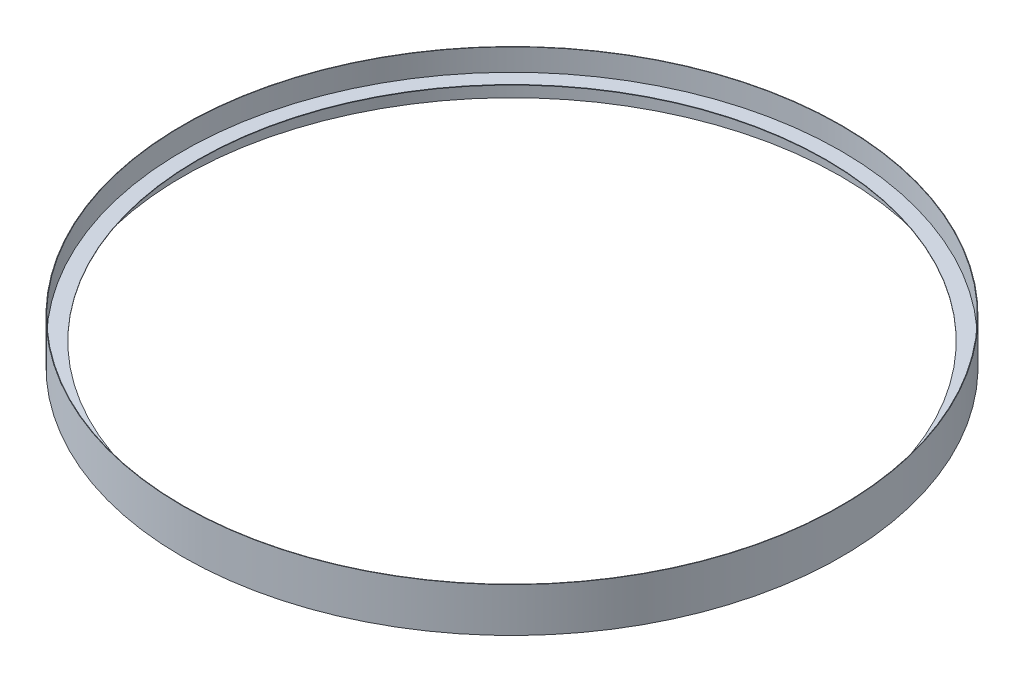
ISO-10303-21;
HEADER;
FILE_DESCRIPTION(('STEP AP214'),'2;1');
FILE_NAME('part.step','',(''),(''),'','','');
FILE_SCHEMA(('AUTOMOTIVE_DESIGN { 1 0 10303 214 1 1 1 1 }'));
ENDSEC;
DATA;
#1=APPLICATION_CONTEXT('core data for automotive mechanical design processes');
#2=APPLICATION_PROTOCOL_DEFINITION('international standard','automotive_design',2000,#1);
#3=PRODUCT_CONTEXT('',#1,'mechanical');
#4=PRODUCT('Part','Part','',(#3));
#5=PRODUCT_RELATED_PRODUCT_CATEGORY('part','',(#4));
#6=PRODUCT_DEFINITION_FORMATION('','',#4);
#7=PRODUCT_DEFINITION_CONTEXT('part definition',#1,'design');
#8=PRODUCT_DEFINITION('design','',#6,#7);
#9=PRODUCT_DEFINITION_SHAPE('','',#8);
#10=(LENGTH_UNIT() NAMED_UNIT(*) SI_UNIT(.MILLI.,.METRE.));
#11=(NAMED_UNIT(*) PLANE_ANGLE_UNIT() SI_UNIT($,.RADIAN.));
#12=(NAMED_UNIT(*) SI_UNIT($,.STERADIAN.) SOLID_ANGLE_UNIT());
#13=UNCERTAINTY_MEASURE_WITH_UNIT(LENGTH_MEASURE(1.E-05),#10,'distance_accuracy_value','');
#14=(GEOMETRIC_REPRESENTATION_CONTEXT(3) GLOBAL_UNCERTAINTY_ASSIGNED_CONTEXT((#13)) GLOBAL_UNIT_ASSIGNED_CONTEXT((#10,
#11,#12)) REPRESENTATION_CONTEXT('',''));
#15=CARTESIAN_POINT('',(0.,0.,0.));
#16=DIRECTION('',(0.,0.,1.));
#17=DIRECTION('',(1.,0.,0.));
#18=AXIS2_PLACEMENT_3D('',#15,#16,#17);
#19=CARTESIAN_POINT('',(0.,0.,0.));
#20=DIRECTION('',(0.,-1.,0.));
#21=DIRECTION('',(0.,0.,-1.));
#22=AXIS2_PLACEMENT_3D('',#19,#20,#21);
#23=CYLINDRICAL_SURFACE('',#22,1493.);
#24=CARTESIAN_POINT('',(0.,2.,0.));
#25=DIRECTION('',(0.,-1.,0.));
#26=DIRECTION('',(0.,0.,-1.));
#27=AXIS2_PLACEMENT_3D('',#24,#25,#26);
#28=CIRCLE('',#27,1493.);
#29=CARTESIAN_POINT('',(0.,2.,-1493.));
#30=VERTEX_POINT('',#29);
#31=EDGE_CURVE('E63',#30,#30,#28,.T.);
#32=ORIENTED_EDGE('',*,*,#31,.T.);
#33=EDGE_LOOP('',(#32));
#34=FACE_BOUND('',#33,.T.);
#35=CARTESIAN_POINT('',(0.,102.,0.));
#36=DIRECTION('',(0.,-1.,0.));
#37=DIRECTION('',(0.,0.,-1.));
#38=AXIS2_PLACEMENT_3D('',#35,#36,#37);
#39=CIRCLE('',#38,1493.);
#40=CARTESIAN_POINT('',(0.,102.,-1493.));
#41=VERTEX_POINT('',#40);
#42=EDGE_CURVE('E10',#41,#41,#39,.T.);
#43=ORIENTED_EDGE('',*,*,#42,.F.);
#44=EDGE_LOOP('',(#43));
#45=FACE_BOUND('',#44,.T.);
#46=ADVANCED_FACE('F35',(#34,#45),#23,.F.);
#47=CARTESIAN_POINT('',(1493.,102.,0.));
#48=DIRECTION('',(0.,1.,0.));
#49=DIRECTION('',(0.,0.,1.));
#50=AXIS2_PLACEMENT_3D('',#47,#48,#49);
#51=PLANE('',#50);
#52=ORIENTED_EDGE('',*,*,#42,.T.);
#53=EDGE_LOOP('',(#52));
#54=FACE_BOUND('',#53,.T.);
#55=CARTESIAN_POINT('',(0.,102.,0.));
#56=DIRECTION('',(0.,-1.,0.));
#57=DIRECTION('',(0.,0.,-1.));
#58=AXIS2_PLACEMENT_3D('',#55,#56,#57);
#59=CIRCLE('',#58,1495.);
#60=CARTESIAN_POINT('',(0.,102.,-1495.));
#61=VERTEX_POINT('',#60);
#62=EDGE_CURVE('E41',#61,#61,#59,.T.);
#63=ORIENTED_EDGE('',*,*,#62,.F.);
#64=EDGE_LOOP('',(#63));
#65=FACE_BOUND('',#64,.T.);
#66=ADVANCED_FACE('F81',(#54,#65),#51,.T.);
#67=CARTESIAN_POINT('',(0.,0.,0.));
#68=DIRECTION('',(0.,-1.,0.));
#69=DIRECTION('',(0.,0.,-1.));
#70=AXIS2_PLACEMENT_3D('',#67,#68,#69);
#71=CYLINDRICAL_SURFACE('',#70,1495.);
#72=ORIENTED_EDGE('',*,*,#62,.T.);
#73=EDGE_LOOP('',(#72));
#74=FACE_BOUND('',#73,.T.);
#75=CARTESIAN_POINT('',(0.,-98.0000000000001,0.));
#76=DIRECTION('',(0.,-1.,0.));
#77=DIRECTION('',(0.,0.,-1.));
#78=AXIS2_PLACEMENT_3D('',#75,#76,#77);
#79=CIRCLE('',#78,1495.);
#80=CARTESIAN_POINT('',(0.,-98.0000000000001,-1495.));
#81=VERTEX_POINT('',#80);
#82=EDGE_CURVE('E45',#81,#81,#79,.T.);
#83=ORIENTED_EDGE('',*,*,#82,.F.);
#84=EDGE_LOOP('',(#83));
#85=FACE_BOUND('',#84,.T.);
#86=ADVANCED_FACE('F85',(#74,#85),#71,.T.);
#87=CARTESIAN_POINT('',(1495.,-98.0000000000001,0.));
#88=DIRECTION('',(0.,-1.,0.));
#89=DIRECTION('',(0.,0.,-1.));
#90=AXIS2_PLACEMENT_3D('',#87,#88,#89);
#91=PLANE('',#90);
#92=ORIENTED_EDGE('',*,*,#82,.T.);
#93=EDGE_LOOP('',(#92));
#94=FACE_BOUND('',#93,.T.);
#95=CARTESIAN_POINT('',(0.,-98.0000000000001,0.));
#96=DIRECTION('',(0.,-1.,0.));
#97=DIRECTION('',(0.,0.,-1.));
#98=AXIS2_PLACEMENT_3D('',#95,#96,#97);
#99=CIRCLE('',#98,1493.);
#100=CARTESIAN_POINT('',(0.,-98.0000000000001,-1493.));
#101=VERTEX_POINT('',#100);
#102=EDGE_CURVE('E49',#101,#101,#99,.T.);
#103=ORIENTED_EDGE('',*,*,#102,.F.);
#104=EDGE_LOOP('',(#103));
#105=FACE_BOUND('',#104,.T.);
#106=ADVANCED_FACE('F89',(#94,#105),#91,.T.);
#107=CARTESIAN_POINT('',(0.,0.,0.));
#108=DIRECTION('',(0.,-1.,0.));
#109=DIRECTION('',(0.,0.,-1.));
#110=AXIS2_PLACEMENT_3D('',#107,#108,#109);
#111=CYLINDRICAL_SURFACE('',#110,1493.);
#112=ORIENTED_EDGE('',*,*,#102,.T.);
#113=EDGE_LOOP('',(#112));
#114=FACE_BOUND('',#113,.T.);
#115=CARTESIAN_POINT('',(0.,0.,0.));
#116=DIRECTION('',(0.,-1.,0.));
#117=DIRECTION('',(0.,0.,-1.));
#118=AXIS2_PLACEMENT_3D('',#115,#116,#117);
#119=CIRCLE('',#118,1493.);
#120=CARTESIAN_POINT('',(0.,0.,-1493.));
#121=VERTEX_POINT('',#120);
#122=EDGE_CURVE('E54',#121,#121,#119,.T.);
#123=ORIENTED_EDGE('',*,*,#122,.F.);
#124=EDGE_LOOP('',(#123));
#125=FACE_BOUND('',#124,.T.);
#126=ADVANCED_FACE('F95',(#114,#125),#111,.F.);
#127=CARTESIAN_POINT('',(1493.,0.,0.));
#128=DIRECTION('',(0.,-1.,0.));
#129=DIRECTION('',(0.,0.,-1.));
#130=AXIS2_PLACEMENT_3D('',#127,#128,#129);
#131=PLANE('',#130);
#132=ORIENTED_EDGE('',*,*,#122,.T.);
#133=EDGE_LOOP('',(#132));
#134=FACE_BOUND('',#133,.T.);
#135=CARTESIAN_POINT('',(0.,0.,0.));
#136=DIRECTION('',(0.,-1.,0.));
#137=DIRECTION('',(0.,0.,-1.));
#138=AXIS2_PLACEMENT_3D('',#135,#136,#137);
#139=CIRCLE('',#138,1425.);
#140=CARTESIAN_POINT('',(0.,0.,-1425.));
#141=VERTEX_POINT('',#140);
#142=EDGE_CURVE('E57',#141,#141,#139,.T.);
#143=ORIENTED_EDGE('',*,*,#142,.F.);
#144=EDGE_LOOP('',(#143));
#145=FACE_BOUND('',#144,.T.);
#146=ADVANCED_FACE('F77',(#134,#145),#131,.T.);
#147=CARTESIAN_POINT('',(0.,0.,0.));
#148=DIRECTION('',(0.,-1.,0.));
#149=DIRECTION('',(0.,0.,-1.));
#150=AXIS2_PLACEMENT_3D('',#147,#148,#149);
#151=CYLINDRICAL_SURFACE('',#150,1425.);
#152=ORIENTED_EDGE('',*,*,#142,.T.);
#153=EDGE_LOOP('',(#152));
#154=FACE_BOUND('',#153,.T.);
#155=CARTESIAN_POINT('',(0.,1.99999999999999,0.));
#156=DIRECTION('',(0.,-1.,0.));
#157=DIRECTION('',(0.,0.,-1.));
#158=AXIS2_PLACEMENT_3D('',#155,#156,#157);
#159=CIRCLE('',#158,1425.);
#160=CARTESIAN_POINT('',(0.,1.99999999999999,-1425.));
#161=VERTEX_POINT('',#160);
#162=EDGE_CURVE('E60',#161,#161,#159,.T.);
#163=ORIENTED_EDGE('',*,*,#162,.F.);
#164=EDGE_LOOP('',(#163));
#165=FACE_BOUND('',#164,.T.);
#166=ADVANCED_FACE('F71',(#154,#165),#151,.F.);
#167=CARTESIAN_POINT('',(1425.,2.,0.));
#168=DIRECTION('',(0.,1.,0.));
#169=DIRECTION('',(0.,0.,1.));
#170=AXIS2_PLACEMENT_3D('',#167,#168,#169);
#171=PLANE('',#170);
#172=ORIENTED_EDGE('',*,*,#162,.T.);
#173=EDGE_LOOP('',(#172));
#174=FACE_BOUND('',#173,.T.);
#175=ORIENTED_EDGE('',*,*,#31,.F.);
#176=EDGE_LOOP('',(#175));
#177=FACE_BOUND('',#176,.T.);
#178=ADVANCED_FACE('F69',(#174,#177),#171,.T.);
#179=CLOSED_SHELL('',(#46,#66,#86,#106,#126,#146,#166,#178));
#180=MANIFOLD_SOLID_BREP('B2',#179);
#181=ADVANCED_BREP_SHAPE_REPRESENTATION('',(#18,#180),#14);
#182=SHAPE_DEFINITION_REPRESENTATION(#9,#181);
ENDSEC;
END-ISO-10303-21;
